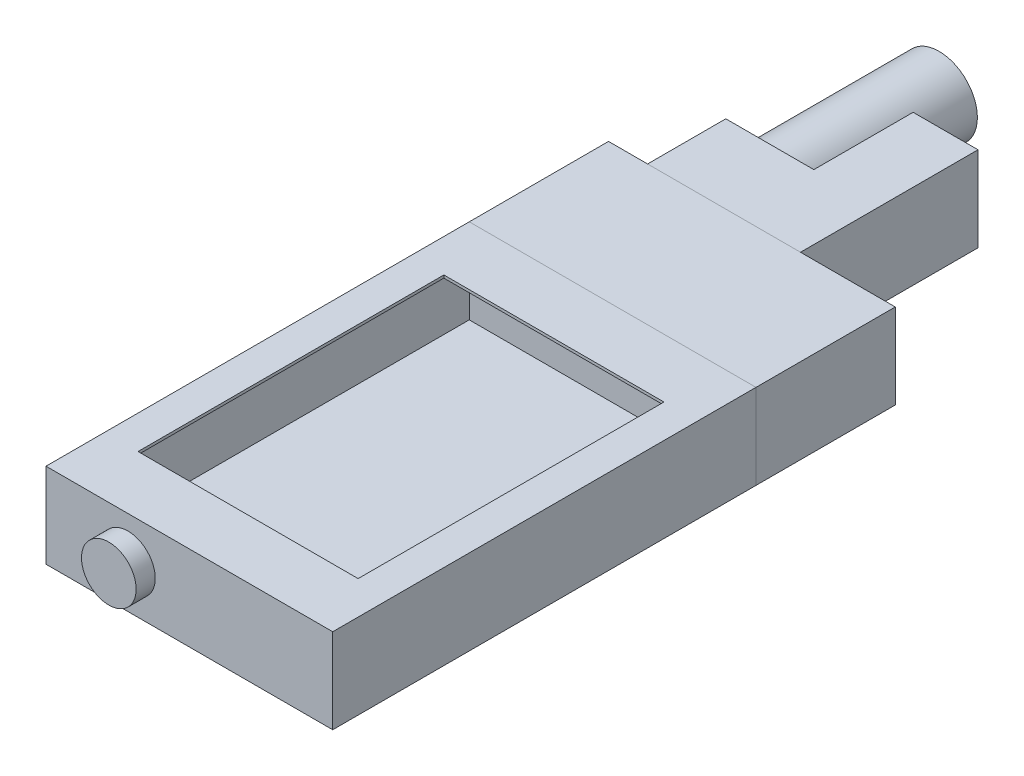
ISO-10303-21;
HEADER;
FILE_DESCRIPTION(('STEP AP214'),'2;1');
FILE_NAME('part.step','',(''),(''),'','','');
FILE_SCHEMA(('AUTOMOTIVE_DESIGN { 1 0 10303 214 1 1 1 1 }'));
ENDSEC;
DATA;
#1=APPLICATION_CONTEXT('core data for automotive mechanical design processes');
#2=APPLICATION_PROTOCOL_DEFINITION('international standard','automotive_design',2000,#1);
#3=PRODUCT_CONTEXT('',#1,'mechanical');
#4=PRODUCT('Part','Part','',(#3));
#5=PRODUCT_RELATED_PRODUCT_CATEGORY('part','',(#4));
#6=PRODUCT_DEFINITION_FORMATION('','',#4);
#7=PRODUCT_DEFINITION_CONTEXT('part definition',#1,'design');
#8=PRODUCT_DEFINITION('design','',#6,#7);
#9=PRODUCT_DEFINITION_SHAPE('','',#8);
#10=(LENGTH_UNIT() NAMED_UNIT(*) SI_UNIT(.MILLI.,.METRE.));
#11=(NAMED_UNIT(*) PLANE_ANGLE_UNIT() SI_UNIT($,.RADIAN.));
#12=(NAMED_UNIT(*) SI_UNIT($,.STERADIAN.) SOLID_ANGLE_UNIT());
#13=UNCERTAINTY_MEASURE_WITH_UNIT(LENGTH_MEASURE(1.E-05),#10,'distance_accuracy_value','');
#14=(GEOMETRIC_REPRESENTATION_CONTEXT(3) GLOBAL_UNCERTAINTY_ASSIGNED_CONTEXT((#13)) GLOBAL_UNIT_ASSIGNED_CONTEXT((#10,
#11,#12)) REPRESENTATION_CONTEXT('',''));
#15=CARTESIAN_POINT('',(0.,0.,0.));
#16=DIRECTION('',(0.,0.,1.));
#17=DIRECTION('',(1.,0.,0.));
#18=AXIS2_PLACEMENT_3D('',#15,#16,#17);
#19=CARTESIAN_POINT('',(0.,15.55,0.));
#20=DIRECTION('',(0.,-1.,0.));
#21=DIRECTION('',(0.,0.,-1.));
#22=AXIS2_PLACEMENT_3D('',#19,#20,#21);
#23=PLANE('',#22);
#24=DIRECTION('',(1.,0.,0.));
#25=VECTOR('',#24,1.);
#26=CARTESIAN_POINT('',(-9.0679364494854,15.55,-128.5));
#27=LINE('',#26,#25);
#28=CARTESIAN_POINT('',(17.8,15.55,-128.5));
#29=VERTEX_POINT('',#28);
#30=CARTESIAN_POINT('',(-38.2,15.55,-128.5));
#31=VERTEX_POINT('',#30);
#32=EDGE_CURVE('P0_E19',#29,#31,#27,.F.);
#33=ORIENTED_EDGE('',*,*,#32,.F.);
#34=DIRECTION('',(0.,0.,-1.));
#35=VECTOR('',#34,1.);
#36=CARTESIAN_POINT('',(17.8,15.55,-128.5));
#37=LINE('',#36,#35);
#38=CARTESIAN_POINT('',(17.8,15.55,-193.5));
#39=VERTEX_POINT('',#38);
#40=EDGE_CURVE('P0_E70',#39,#29,#37,.F.);
#41=ORIENTED_EDGE('',*,*,#40,.F.);
#42=DIRECTION('',(-1.,0.,0.));
#43=VECTOR('',#42,1.);
#44=CARTESIAN_POINT('',(-5.96,15.55,-193.5));
#45=LINE('',#44,#43);
#46=CARTESIAN_POINT('',(-5.95999999999999,15.55,-193.5));
#47=VERTEX_POINT('',#46);
#48=EDGE_CURVE('P0_E65',#47,#39,#45,.F.);
#49=ORIENTED_EDGE('',*,*,#48,.F.);
#50=DIRECTION('',(0.,0.,1.));
#51=VECTOR('',#50,1.);
#52=CARTESIAN_POINT('',(-5.95999999999999,15.55,-157.15));
#53=LINE('',#52,#51);
#54=CARTESIAN_POINT('',(-5.95999999999999,15.55,-157.15));
#55=VERTEX_POINT('',#54);
#56=EDGE_CURVE('P0_E92',#55,#47,#53,.F.);
#57=ORIENTED_EDGE('',*,*,#56,.F.);
#58=DIRECTION('',(-1.,0.,0.));
#59=VECTOR('',#58,1.);
#60=CARTESIAN_POINT('',(-38.2,15.55,-157.15));
#61=LINE('',#60,#59);
#62=CARTESIAN_POINT('',(-38.2,15.55,-157.15));
#63=VERTEX_POINT('',#62);
#64=EDGE_CURVE('P0_E96',#63,#55,#61,.F.);
#65=ORIENTED_EDGE('',*,*,#64,.F.);
#66=DIRECTION('',(0.,0.,1.));
#67=VECTOR('',#66,1.);
#68=CARTESIAN_POINT('',(-38.2,15.55,-128.5));
#69=LINE('',#68,#67);
#70=EDGE_CURVE('P0_E81',#31,#63,#69,.F.);
#71=ORIENTED_EDGE('',*,*,#70,.F.);
#72=EDGE_LOOP('',(#33,#41,#49,#57,#65,#71));
#73=FACE_BOUND('',#72,.T.);
#74=ADVANCED_FACE('P0_F16',(#73),#23,.F.);
#75=CARTESIAN_POINT('',(-9.0679364494854,-101.346270315207,-128.5));
#76=DIRECTION('',(0.,0.,1.));
#77=DIRECTION('',(1.,0.,0.));
#78=AXIS2_PLACEMENT_3D('',#75,#76,#77);
#79=PLANE('',#78);
#80=ORIENTED_EDGE('',*,*,#32,.T.);
#81=DIRECTION('',(0.,1.,0.));
#82=VECTOR('',#81,1.);
#83=CARTESIAN_POINT('',(-38.2,-101.346270315207,-128.5));
#84=LINE('',#83,#82);
#85=CARTESIAN_POINT('',(-38.2,-15.55,-128.5));
#86=VERTEX_POINT('',#85);
#87=EDGE_CURVE('P0_E100',#86,#31,#84,.T.);
#88=ORIENTED_EDGE('',*,*,#87,.F.);
#89=DIRECTION('',(1.,0.,0.));
#90=VECTOR('',#89,1.);
#91=CARTESIAN_POINT('',(52.5,-15.55,-128.5));
#92=LINE('',#91,#90);
#93=CARTESIAN_POINT('',(17.8,-15.55,-128.5));
#94=VERTEX_POINT('',#93);
#95=EDGE_CURVE('P0_E87',#86,#94,#92,.T.);
#96=ORIENTED_EDGE('',*,*,#95,.T.);
#97=DIRECTION('',(0.,1.,0.));
#98=VECTOR('',#97,1.);
#99=CARTESIAN_POINT('',(17.8,-101.346270315207,-128.5));
#100=LINE('',#99,#98);
#101=EDGE_CURVE('P0_E75',#29,#94,#100,.F.);
#102=ORIENTED_EDGE('',*,*,#101,.F.);
#103=EDGE_LOOP('',(#80,#88,#96,#102));
#104=FACE_BOUND('',#103,.T.);
#105=ADVANCED_FACE('P0_F86',(#104),#79,.T.);
#106=CARTESIAN_POINT('',(17.8,-101.346270315207,-128.5));
#107=DIRECTION('',(1.,0.,0.));
#108=DIRECTION('',(0.,0.,-1.));
#109=AXIS2_PLACEMENT_3D('',#106,#107,#108);
#110=PLANE('',#109);
#111=ORIENTED_EDGE('',*,*,#40,.T.);
#112=ORIENTED_EDGE('',*,*,#101,.T.);
#113=DIRECTION('',(0.,0.,1.));
#114=VECTOR('',#113,1.);
#115=CARTESIAN_POINT('',(17.8,-15.55,77.5));
#116=LINE('',#115,#114);
#117=CARTESIAN_POINT('',(17.8,-15.55,-193.5));
#118=VERTEX_POINT('',#117);
#119=EDGE_CURVE('P0_E105',#94,#118,#116,.F.);
#120=ORIENTED_EDGE('',*,*,#119,.T.);
#121=DIRECTION('',(0.,1.,0.));
#122=VECTOR('',#121,1.);
#123=CARTESIAN_POINT('',(17.8,-101.346270315207,-193.5));
#124=LINE('',#123,#122);
#125=EDGE_CURVE('P0_E77',#39,#118,#124,.F.);
#126=ORIENTED_EDGE('',*,*,#125,.F.);
#127=EDGE_LOOP('',(#111,#112,#120,#126));
#128=FACE_BOUND('',#127,.T.);
#129=ADVANCED_FACE('P0_F72',(#128),#110,.T.);
#130=CARTESIAN_POINT('',(-5.96,-101.346270315207,-193.5));
#131=DIRECTION('',(0.,0.,-1.));
#132=DIRECTION('',(-1.,0.,0.));
#133=AXIS2_PLACEMENT_3D('',#130,#131,#132);
#134=PLANE('',#133);
#135=ORIENTED_EDGE('',*,*,#48,.T.);
#136=ORIENTED_EDGE('',*,*,#125,.T.);
#137=DIRECTION('',(1.,0.,0.));
#138=VECTOR('',#137,1.);
#139=CARTESIAN_POINT('',(52.5,-15.55,-193.5));
#140=LINE('',#139,#138);
#141=CARTESIAN_POINT('',(-5.96,-15.55,-193.5));
#142=VERTEX_POINT('',#141);
#143=EDGE_CURVE('P0_E107',#118,#142,#140,.F.);
#144=ORIENTED_EDGE('',*,*,#143,.T.);
#145=DIRECTION('',(0.,1.,0.));
#146=VECTOR('',#145,1.);
#147=CARTESIAN_POINT('',(-5.96,-101.346270315207,-193.5));
#148=LINE('',#147,#146);
#149=EDGE_CURVE('P0_E94',#47,#142,#148,.F.);
#150=ORIENTED_EDGE('',*,*,#149,.F.);
#151=EDGE_LOOP('',(#135,#136,#144,#150));
#152=FACE_BOUND('',#151,.T.);
#153=ADVANCED_FACE('P0_F125',(#152),#134,.T.);
#154=CARTESIAN_POINT('',(-5.95999999999999,-101.346270315207,-157.15));
#155=DIRECTION('',(-1.,0.,0.));
#156=DIRECTION('',(0.,0.,1.));
#157=AXIS2_PLACEMENT_3D('',#154,#155,#156);
#158=PLANE('',#157);
#159=ORIENTED_EDGE('',*,*,#56,.T.);
#160=ORIENTED_EDGE('',*,*,#149,.T.);
#161=DIRECTION('',(0.,0.,1.));
#162=VECTOR('',#161,1.);
#163=CARTESIAN_POINT('',(-5.96,-15.55,77.5));
#164=LINE('',#163,#162);
#165=CARTESIAN_POINT('',(-5.95999999999999,-15.55,-157.15));
#166=VERTEX_POINT('',#165);
#167=EDGE_CURVE('P0_E110',#142,#166,#164,.T.);
#168=ORIENTED_EDGE('',*,*,#167,.T.);
#169=DIRECTION('',(0.,1.,0.));
#170=VECTOR('',#169,1.);
#171=CARTESIAN_POINT('',(-5.95999999999999,-101.346270315207,-157.15));
#172=LINE('',#171,#170);
#173=EDGE_CURVE('P0_E98',#55,#166,#172,.F.);
#174=ORIENTED_EDGE('',*,*,#173,.F.);
#175=EDGE_LOOP('',(#159,#160,#168,#174));
#176=FACE_BOUND('',#175,.T.);
#177=ADVANCED_FACE('P0_F123',(#176),#158,.T.);
#178=CARTESIAN_POINT('',(-38.2,-101.346270315207,-157.15));
#179=DIRECTION('',(0.,0.,-1.));
#180=DIRECTION('',(-1.,0.,0.));
#181=AXIS2_PLACEMENT_3D('',#178,#179,#180);
#182=PLANE('',#181);
#183=ORIENTED_EDGE('',*,*,#64,.T.);
#184=ORIENTED_EDGE('',*,*,#173,.T.);
#185=DIRECTION('',(1.,0.,0.));
#186=VECTOR('',#185,1.);
#187=CARTESIAN_POINT('',(52.5,-15.55,-157.15));
#188=LINE('',#187,#186);
#189=CARTESIAN_POINT('',(-38.2,-15.55,-157.15));
#190=VERTEX_POINT('',#189);
#191=EDGE_CURVE('P0_E25',#166,#190,#188,.F.);
#192=ORIENTED_EDGE('',*,*,#191,.T.);
#193=DIRECTION('',(0.,1.,0.));
#194=VECTOR('',#193,1.);
#195=CARTESIAN_POINT('',(-38.2,-101.346270315207,-157.15));
#196=LINE('',#195,#194);
#197=EDGE_CURVE('P0_E33',#63,#190,#196,.F.);
#198=ORIENTED_EDGE('',*,*,#197,.F.);
#199=EDGE_LOOP('',(#183,#184,#192,#198));
#200=FACE_BOUND('',#199,.T.);
#201=ADVANCED_FACE('P0_F116',(#200),#182,.T.);
#202=CARTESIAN_POINT('',(-38.2,-101.346270315207,-128.5));
#203=DIRECTION('',(-1.,0.,0.));
#204=DIRECTION('',(0.,0.,1.));
#205=AXIS2_PLACEMENT_3D('',#202,#203,#204);
#206=PLANE('',#205);
#207=ORIENTED_EDGE('',*,*,#70,.T.);
#208=ORIENTED_EDGE('',*,*,#197,.T.);
#209=DIRECTION('',(0.,0.,1.));
#210=VECTOR('',#209,1.);
#211=CARTESIAN_POINT('',(-38.2,-15.55,77.5));
#212=LINE('',#211,#210);
#213=EDGE_CURVE('P0_E11',#190,#86,#212,.T.);
#214=ORIENTED_EDGE('',*,*,#213,.T.);
#215=ORIENTED_EDGE('',*,*,#87,.T.);
#216=EDGE_LOOP('',(#207,#208,#214,#215));
#217=FACE_BOUND('',#216,.T.);
#218=ADVANCED_FACE('P0_F126',(#217),#206,.T.);
#219=CARTESIAN_POINT('',(52.5,-15.55,77.5));
#220=DIRECTION('',(0.,1.,0.));
#221=DIRECTION('',(0.,0.,1.));
#222=AXIS2_PLACEMENT_3D('',#219,#220,#221);
#223=PLANE('',#222);
#224=ORIENTED_EDGE('',*,*,#191,.F.);
#225=ORIENTED_EDGE('',*,*,#167,.F.);
#226=ORIENTED_EDGE('',*,*,#143,.F.);
#227=ORIENTED_EDGE('',*,*,#119,.F.);
#228=ORIENTED_EDGE('',*,*,#95,.F.);
#229=ORIENTED_EDGE('',*,*,#213,.F.);
#230=EDGE_LOOP('',(#224,#225,#226,#227,#228,#229));
#231=FACE_BOUND('',#230,.T.);
#232=ADVANCED_FACE('P0_F120',(#231),#223,.F.);
#233=CLOSED_SHELL('',(#74,#105,#129,#153,#177,#201,#218,#232));
#234=MANIFOLD_SOLID_BREP('P0_B1',#233);
#235=CARTESIAN_POINT('',(-22.08,0.,-219.15));
#236=DIRECTION('',(0.,0.,-1.));
#237=DIRECTION('',(-1.,0.,0.));
#238=AXIS2_PLACEMENT_3D('',#235,#236,#237);
#239=PLANE('',#238);
#240=CARTESIAN_POINT('',(-22.08,0.,-219.15));
#241=DIRECTION('',(0.,0.,1.));
#242=DIRECTION('',(1.,0.,0.));
#243=AXIS2_PLACEMENT_3D('',#240,#241,#242);
#244=CIRCLE('',#243,14.);
#245=CARTESIAN_POINT('',(-8.07999999999999,0.,-219.15));
#246=VERTEX_POINT('',#245);
#247=EDGE_CURVE('P1_E17',#246,#246,#244,.T.);
#248=ORIENTED_EDGE('',*,*,#247,.F.);
#249=EDGE_LOOP('',(#248));
#250=FACE_BOUND('',#249,.T.);
#251=ADVANCED_FACE('P1_F14',(#250),#239,.T.);
#252=CARTESIAN_POINT('',(-22.08,0.,-157.15));
#253=DIRECTION('',(0.,0.,-1.));
#254=DIRECTION('',(-1.,0.,0.));
#255=AXIS2_PLACEMENT_3D('',#252,#253,#254);
#256=PLANE('',#255);
#257=CARTESIAN_POINT('',(-22.08,0.,-157.15));
#258=DIRECTION('',(0.,0.,1.));
#259=DIRECTION('',(1.,0.,0.));
#260=AXIS2_PLACEMENT_3D('',#257,#258,#259);
#261=CIRCLE('',#260,14.);
#262=CARTESIAN_POINT('',(-8.07999999999999,0.,-157.15));
#263=VERTEX_POINT('',#262);
#264=EDGE_CURVE('P1_E10',#263,#263,#261,.F.);
#265=ORIENTED_EDGE('',*,*,#264,.F.);
#266=EDGE_LOOP('',(#265));
#267=FACE_BOUND('',#266,.T.);
#268=ADVANCED_FACE('P1_F29',(#267),#256,.F.);
#269=CARTESIAN_POINT('',(-22.08,0.,-219.15));
#270=DIRECTION('',(0.,0.,1.));
#271=DIRECTION('',(1.,0.,0.));
#272=AXIS2_PLACEMENT_3D('',#269,#270,#271);
#273=CYLINDRICAL_SURFACE('',#272,14.);
#274=ORIENTED_EDGE('',*,*,#264,.T.);
#275=EDGE_LOOP('',(#274));
#276=FACE_BOUND('',#275,.T.);
#277=ORIENTED_EDGE('',*,*,#247,.T.);
#278=EDGE_LOOP('',(#277));
#279=FACE_BOUND('',#278,.T.);
#280=ADVANCED_FACE('P1_F26',(#276,#279),#273,.T.);
#281=CLOSED_SHELL('',(#251,#268,#280));
#282=MANIFOLD_SOLID_BREP('P1_B1',#281);
#283=CARTESIAN_POINT('',(52.5,-15.55,77.5));
#284=DIRECTION('',(0.,1.,0.));
#285=DIRECTION('',(0.,0.,1.));
#286=AXIS2_PLACEMENT_3D('',#283,#284,#285);
#287=PLANE('',#286);
#288=DIRECTION('',(-1.,0.,0.));
#289=VECTOR('',#288,1.);
#290=CARTESIAN_POINT('',(-52.5,-15.55,-128.5));
#291=LINE('',#290,#289);
#292=CARTESIAN_POINT('',(52.5,-15.55,-128.5));
#293=VERTEX_POINT('',#292);
#294=CARTESIAN_POINT('',(-52.5,-15.55,-128.5));
#295=VERTEX_POINT('',#294);
#296=EDGE_CURVE('P2_E19',#293,#295,#291,.T.);
#297=ORIENTED_EDGE('',*,*,#296,.F.);
#298=DIRECTION('',(0.,0.,-1.));
#299=VECTOR('',#298,1.);
#300=CARTESIAN_POINT('',(52.5,-15.55,-77.5));
#301=LINE('',#300,#299);
#302=CARTESIAN_POINT('',(52.5,-15.55,-77.5));
#303=VERTEX_POINT('',#302);
#304=EDGE_CURVE('P2_E57',#303,#293,#301,.T.);
#305=ORIENTED_EDGE('',*,*,#304,.F.);
#306=DIRECTION('',(1.,0.,0.));
#307=VECTOR('',#306,1.);
#308=CARTESIAN_POINT('',(-52.5,-15.55,-77.5));
#309=LINE('',#308,#307);
#310=CARTESIAN_POINT('',(-52.5,-15.55,-77.5));
#311=VERTEX_POINT('',#310);
#312=EDGE_CURVE('P2_E52',#311,#303,#309,.T.);
#313=ORIENTED_EDGE('',*,*,#312,.F.);
#314=DIRECTION('',(0.,0.,1.));
#315=VECTOR('',#314,1.);
#316=CARTESIAN_POINT('',(-52.5,-15.55,-77.5));
#317=LINE('',#316,#315);
#318=EDGE_CURVE('P2_E67',#295,#311,#317,.T.);
#319=ORIENTED_EDGE('',*,*,#318,.F.);
#320=EDGE_LOOP('',(#297,#305,#313,#319));
#321=FACE_BOUND('',#320,.T.);
#322=ADVANCED_FACE('P2_F16',(#321),#287,.F.);
#323=CARTESIAN_POINT('',(-52.5,-132.280458750062,-128.5));
#324=DIRECTION('',(0.,0.,-1.));
#325=DIRECTION('',(-1.,0.,0.));
#326=AXIS2_PLACEMENT_3D('',#323,#324,#325);
#327=PLANE('',#326);
#328=DIRECTION('',(1.,0.,0.));
#329=VECTOR('',#328,1.);
#330=CARTESIAN_POINT('',(0.,15.55,-128.5));
#331=LINE('',#330,#329);
#332=CARTESIAN_POINT('',(-52.5,15.55,-128.5));
#333=VERTEX_POINT('',#332);
#334=CARTESIAN_POINT('',(52.5,15.55,-128.5));
#335=VERTEX_POINT('',#334);
#336=EDGE_CURVE('P2_E73',#333,#335,#331,.T.);
#337=ORIENTED_EDGE('',*,*,#336,.T.);
#338=DIRECTION('',(0.,1.,0.));
#339=VECTOR('',#338,1.);
#340=CARTESIAN_POINT('',(52.5,-132.280458750062,-128.5));
#341=LINE('',#340,#339);
#342=EDGE_CURVE('P2_E62',#293,#335,#341,.T.);
#343=ORIENTED_EDGE('',*,*,#342,.F.);
#344=ORIENTED_EDGE('',*,*,#296,.T.);
#345=DIRECTION('',(0.,1.,0.));
#346=VECTOR('',#345,1.);
#347=CARTESIAN_POINT('',(-52.5,-132.280458750062,-128.5));
#348=LINE('',#347,#346);
#349=EDGE_CURVE('P2_E80',#333,#295,#348,.F.);
#350=ORIENTED_EDGE('',*,*,#349,.F.);
#351=EDGE_LOOP('',(#337,#343,#344,#350));
#352=FACE_BOUND('',#351,.T.);
#353=ADVANCED_FACE('P2_F72',(#352),#327,.T.);
#354=CARTESIAN_POINT('',(52.5,-132.280458750062,-77.5));
#355=DIRECTION('',(1.,0.,0.));
#356=DIRECTION('',(0.,0.,-1.));
#357=AXIS2_PLACEMENT_3D('',#354,#355,#356);
#358=PLANE('',#357);
#359=DIRECTION('',(0.,0.,-1.));
#360=VECTOR('',#359,1.);
#361=CARTESIAN_POINT('',(52.5,15.55,0.));
#362=LINE('',#361,#360);
#363=CARTESIAN_POINT('',(52.5,15.55,-77.5));
#364=VERTEX_POINT('',#363);
#365=EDGE_CURVE('P2_E83',#335,#364,#362,.F.);
#366=ORIENTED_EDGE('',*,*,#365,.T.);
#367=DIRECTION('',(0.,1.,0.));
#368=VECTOR('',#367,1.);
#369=CARTESIAN_POINT('',(52.5,-132.280458750062,-77.5));
#370=LINE('',#369,#368);
#371=EDGE_CURVE('P2_E64',#303,#364,#370,.T.);
#372=ORIENTED_EDGE('',*,*,#371,.F.);
#373=ORIENTED_EDGE('',*,*,#304,.T.);
#374=ORIENTED_EDGE('',*,*,#342,.T.);
#375=EDGE_LOOP('',(#366,#372,#373,#374));
#376=FACE_BOUND('',#375,.T.);
#377=ADVANCED_FACE('P2_F60',(#376),#358,.T.);
#378=CARTESIAN_POINT('',(-52.5,-132.280458750062,-77.5));
#379=DIRECTION('',(0.,0.,1.));
#380=DIRECTION('',(1.,0.,0.));
#381=AXIS2_PLACEMENT_3D('',#378,#379,#380);
#382=PLANE('',#381);
#383=DIRECTION('',(1.,0.,0.));
#384=VECTOR('',#383,1.);
#385=CARTESIAN_POINT('',(0.,15.55,-77.5));
#386=LINE('',#385,#384);
#387=CARTESIAN_POINT('',(-52.5,15.55,-77.5));
#388=VERTEX_POINT('',#387);
#389=EDGE_CURVE('P2_E25',#364,#388,#386,.F.);
#390=ORIENTED_EDGE('',*,*,#389,.T.);
#391=DIRECTION('',(0.,1.,0.));
#392=VECTOR('',#391,1.);
#393=CARTESIAN_POINT('',(-52.5,-132.280458750062,-77.5));
#394=LINE('',#393,#392);
#395=EDGE_CURVE('P2_E33',#311,#388,#394,.T.);
#396=ORIENTED_EDGE('',*,*,#395,.F.);
#397=ORIENTED_EDGE('',*,*,#312,.T.);
#398=ORIENTED_EDGE('',*,*,#371,.T.);
#399=EDGE_LOOP('',(#390,#396,#397,#398));
#400=FACE_BOUND('',#399,.T.);
#401=ADVANCED_FACE('P2_F87',(#400),#382,.T.);
#402=CARTESIAN_POINT('',(-52.5,-132.280458750062,-77.5));
#403=DIRECTION('',(-1.,0.,0.));
#404=DIRECTION('',(0.,0.,1.));
#405=AXIS2_PLACEMENT_3D('',#402,#403,#404);
#406=PLANE('',#405);
#407=DIRECTION('',(0.,0.,-1.));
#408=VECTOR('',#407,1.);
#409=CARTESIAN_POINT('',(-52.5,15.55,0.));
#410=LINE('',#409,#408);
#411=EDGE_CURVE('P2_E11',#388,#333,#410,.T.);
#412=ORIENTED_EDGE('',*,*,#411,.T.);
#413=ORIENTED_EDGE('',*,*,#349,.T.);
#414=ORIENTED_EDGE('',*,*,#318,.T.);
#415=ORIENTED_EDGE('',*,*,#395,.T.);
#416=EDGE_LOOP('',(#412,#413,#414,#415));
#417=FACE_BOUND('',#416,.T.);
#418=ADVANCED_FACE('P2_F90',(#417),#406,.T.);
#419=CARTESIAN_POINT('',(0.,15.55,0.));
#420=DIRECTION('',(0.,-1.,0.));
#421=DIRECTION('',(0.,0.,-1.));
#422=AXIS2_PLACEMENT_3D('',#419,#420,#421);
#423=PLANE('',#422);
#424=ORIENTED_EDGE('',*,*,#389,.F.);
#425=ORIENTED_EDGE('',*,*,#365,.F.);
#426=ORIENTED_EDGE('',*,*,#336,.F.);
#427=ORIENTED_EDGE('',*,*,#411,.F.);
#428=EDGE_LOOP('',(#424,#425,#426,#427));
#429=FACE_BOUND('',#428,.T.);
#430=ADVANCED_FACE('P2_F89',(#429),#423,.F.);
#431=CLOSED_SHELL('',(#322,#353,#377,#401,#418,#430));
#432=MANIFOLD_SOLID_BREP('P2_B1',#431);
#433=CARTESIAN_POINT('',(0.,0.,83.5));
#434=DIRECTION('',(0.,0.,1.));
#435=DIRECTION('',(1.,0.,0.));
#436=AXIS2_PLACEMENT_3D('',#433,#434,#435);
#437=PLANE('',#436);
#438=CARTESIAN_POINT('',(-22.5,0.,83.5));
#439=DIRECTION('',(0.,0.,-1.));
#440=DIRECTION('',(-1.,0.,0.));
#441=AXIS2_PLACEMENT_3D('',#438,#439,#440);
#442=CIRCLE('',#441,9.);
#443=CARTESIAN_POINT('',(-31.5,0.,83.5));
#444=VERTEX_POINT('',#443);
#445=EDGE_CURVE('P3_E19',#444,#444,#442,.T.);
#446=ORIENTED_EDGE('',*,*,#445,.T.);
#447=EDGE_LOOP('',(#446));
#448=FACE_BOUND('',#447,.T.);
#449=ADVANCED_FACE('P3_F16',(#448),#437,.F.);
#450=CARTESIAN_POINT('',(-22.5,0.,84.5));
#451=DIRECTION('',(0.,0.,-1.));
#452=DIRECTION('',(-1.,0.,0.));
#453=AXIS2_PLACEMENT_3D('',#450,#451,#452);
#454=CYLINDRICAL_SURFACE('',#453,9.);
#455=CARTESIAN_POINT('',(-22.5,0.,76.5));
#456=DIRECTION('',(0.,0.,-1.));
#457=DIRECTION('',(-1.,0.,0.));
#458=AXIS2_PLACEMENT_3D('',#455,#456,#457);
#459=CIRCLE('',#458,9.);
#460=CARTESIAN_POINT('',(-31.5,0.,76.5));
#461=VERTEX_POINT('',#460);
#462=EDGE_CURVE('P3_E121',#461,#461,#459,.T.);
#463=ORIENTED_EDGE('',*,*,#462,.T.);
#464=EDGE_LOOP('',(#463));
#465=FACE_BOUND('',#464,.T.);
#466=ORIENTED_EDGE('',*,*,#445,.F.);
#467=EDGE_LOOP('',(#466));
#468=FACE_BOUND('',#467,.T.);
#469=ADVANCED_FACE('P3_F159',(#465,#468),#454,.F.);
#470=CARTESIAN_POINT('',(52.5,-14.55,77.5));
#471=DIRECTION('',(0.,1.,0.));
#472=DIRECTION('',(0.,0.,1.));
#473=AXIS2_PLACEMENT_3D('',#470,#471,#472);
#474=PLANE('',#473);
#475=DIRECTION('',(0.,0.,1.));
#476=VECTOR('',#475,1.);
#477=CARTESIAN_POINT('',(51.5,-14.55,0.));
#478=LINE('',#477,#476);
#479=CARTESIAN_POINT('',(51.5,-14.55,-76.5));
#480=VERTEX_POINT('',#479);
#481=CARTESIAN_POINT('',(51.5,-14.55,76.5));
#482=VERTEX_POINT('',#481);
#483=EDGE_CURVE('P3_E112',#480,#482,#478,.T.);
#484=ORIENTED_EDGE('',*,*,#483,.F.);
#485=DIRECTION('',(1.,0.,0.));
#486=VECTOR('',#485,1.);
#487=CARTESIAN_POINT('',(52.5,-14.55,-76.5));
#488=LINE('',#487,#486);
#489=CARTESIAN_POINT('',(-51.5,-14.55,-76.5));
#490=VERTEX_POINT('',#489);
#491=EDGE_CURVE('P3_E104',#490,#480,#488,.T.);
#492=ORIENTED_EDGE('',*,*,#491,.F.);
#493=DIRECTION('',(0.,0.,1.));
#494=VECTOR('',#493,1.);
#495=CARTESIAN_POINT('',(-51.5,-14.55,0.));
#496=LINE('',#495,#494);
#497=CARTESIAN_POINT('',(-51.5,-14.55,76.5));
#498=VERTEX_POINT('',#497);
#499=EDGE_CURVE('P3_E115',#490,#498,#496,.T.);
#500=ORIENTED_EDGE('',*,*,#499,.T.);
#501=DIRECTION('',(1.,0.,0.));
#502=VECTOR('',#501,1.);
#503=CARTESIAN_POINT('',(52.5,-14.55,76.5));
#504=LINE('',#503,#502);
#505=EDGE_CURVE('P3_E109',#498,#482,#504,.T.);
#506=ORIENTED_EDGE('',*,*,#505,.T.);
#507=EDGE_LOOP('',(#484,#492,#500,#506));
#508=FACE_BOUND('',#507,.T.);
#509=ADVANCED_FACE('P3_F111',(#508),#474,.T.);
#510=CARTESIAN_POINT('',(52.5,-15.55,76.5));
#511=DIRECTION('',(0.,0.,1.));
#512=DIRECTION('',(1.,0.,0.));
#513=AXIS2_PLACEMENT_3D('',#510,#511,#512);
#514=PLANE('',#513);
#515=DIRECTION('',(1.,0.,0.));
#516=VECTOR('',#515,1.);
#517=CARTESIAN_POINT('',(52.5,14.55,76.5));
#518=LINE('',#517,#516);
#519=CARTESIAN_POINT('',(-51.5,14.55,76.5));
#520=VERTEX_POINT('',#519);
#521=CARTESIAN_POINT('',(51.5,14.55,76.5));
#522=VERTEX_POINT('',#521);
#523=EDGE_CURVE('P3_E132',#520,#522,#518,.T.);
#524=ORIENTED_EDGE('',*,*,#523,.T.);
#525=DIRECTION('',(0.,1.,0.));
#526=VECTOR('',#525,1.);
#527=CARTESIAN_POINT('',(51.5,0.,76.5));
#528=LINE('',#527,#526);
#529=EDGE_CURVE('P3_E120',#482,#522,#528,.T.);
#530=ORIENTED_EDGE('',*,*,#529,.F.);
#531=ORIENTED_EDGE('',*,*,#505,.F.);
#532=DIRECTION('',(0.,1.,0.));
#533=VECTOR('',#532,1.);
#534=CARTESIAN_POINT('',(-51.5,0.,76.5));
#535=LINE('',#534,#533);
#536=EDGE_CURVE('P3_E422',#498,#520,#535,.T.);
#537=ORIENTED_EDGE('',*,*,#536,.T.);
#538=EDGE_LOOP('',(#524,#530,#531,#537));
#539=FACE_BOUND('',#538,.T.);
#540=ORIENTED_EDGE('',*,*,#462,.F.);
#541=EDGE_LOOP('',(#540));
#542=FACE_BOUND('',#541,.T.);
#543=ADVANCED_FACE('P3_F130',(#539,#542),#514,.F.);
#544=CARTESIAN_POINT('',(51.5,0.,0.));
#545=DIRECTION('',(-1.,0.,0.));
#546=DIRECTION('',(0.,0.,1.));
#547=AXIS2_PLACEMENT_3D('',#544,#545,#546);
#548=PLANE('',#547);
#549=DIRECTION('',(0.,1.,0.));
#550=VECTOR('',#549,1.);
#551=CARTESIAN_POINT('',(51.5,-15.55,-76.5));
#552=LINE('',#551,#550);
#553=CARTESIAN_POINT('',(51.5,14.55,-76.5));
#554=VERTEX_POINT('',#553);
#555=EDGE_CURVE('P3_E127',#480,#554,#552,.T.);
#556=ORIENTED_EDGE('',*,*,#555,.F.);
#557=ORIENTED_EDGE('',*,*,#483,.T.);
#558=ORIENTED_EDGE('',*,*,#529,.T.);
#559=DIRECTION('',(0.,0.,1.));
#560=VECTOR('',#559,1.);
#561=CARTESIAN_POINT('',(51.5,14.55,77.5));
#562=LINE('',#561,#560);
#563=EDGE_CURVE('P3_E414',#522,#554,#562,.F.);
#564=ORIENTED_EDGE('',*,*,#563,.T.);
#565=EDGE_LOOP('',(#556,#557,#558,#564));
#566=FACE_BOUND('',#565,.T.);
#567=ADVANCED_FACE('P3_F124',(#566),#548,.T.);
#568=CARTESIAN_POINT('',(52.5,-15.55,-76.5));
#569=DIRECTION('',(0.,0.,1.));
#570=DIRECTION('',(1.,0.,0.));
#571=AXIS2_PLACEMENT_3D('',#568,#569,#570);
#572=PLANE('',#571);
#573=ORIENTED_EDGE('',*,*,#555,.T.);
#574=DIRECTION('',(1.,0.,0.));
#575=VECTOR('',#574,1.);
#576=CARTESIAN_POINT('',(52.5,14.55,-76.5));
#577=LINE('',#576,#575);
#578=CARTESIAN_POINT('',(-51.5,14.55,-76.5));
#579=VERTEX_POINT('',#578);
#580=EDGE_CURVE('P3_E409',#554,#579,#577,.F.);
#581=ORIENTED_EDGE('',*,*,#580,.T.);
#582=DIRECTION('',(0.,1.,0.));
#583=VECTOR('',#582,1.);
#584=CARTESIAN_POINT('',(-51.5,0.,-76.5));
#585=LINE('',#584,#583);
#586=EDGE_CURVE('P3_E410',#579,#490,#585,.F.);
#587=ORIENTED_EDGE('',*,*,#586,.T.);
#588=ORIENTED_EDGE('',*,*,#491,.T.);
#589=EDGE_LOOP('',(#573,#581,#587,#588));
#590=FACE_BOUND('',#589,.T.);
#591=ADVANCED_FACE('P3_F226',(#590),#572,.T.);
#592=CARTESIAN_POINT('',(-51.5,0.,0.));
#593=DIRECTION('',(-1.,0.,0.));
#594=DIRECTION('',(0.,0.,1.));
#595=AXIS2_PLACEMENT_3D('',#592,#593,#594);
#596=PLANE('',#595);
#597=ORIENTED_EDGE('',*,*,#499,.F.);
#598=ORIENTED_EDGE('',*,*,#586,.F.);
#599=DIRECTION('',(0.,0.,1.));
#600=VECTOR('',#599,1.);
#601=CARTESIAN_POINT('',(-51.5,14.55,77.5));
#602=LINE('',#601,#600);
#603=EDGE_CURVE('P3_E416',#579,#520,#602,.T.);
#604=ORIENTED_EDGE('',*,*,#603,.T.);
#605=ORIENTED_EDGE('',*,*,#536,.F.);
#606=EDGE_LOOP('',(#597,#598,#604,#605));
#607=FACE_BOUND('',#606,.T.);
#608=ADVANCED_FACE('P3_F222',(#607),#596,.F.);
#609=CARTESIAN_POINT('',(52.5,14.55,77.5));
#610=DIRECTION('',(0.,1.,0.));
#611=DIRECTION('',(0.,0.,1.));
#612=AXIS2_PLACEMENT_3D('',#609,#610,#611);
#613=PLANE('',#612);
#614=ORIENTED_EDGE('',*,*,#580,.F.);
#615=ORIENTED_EDGE('',*,*,#563,.F.);
#616=ORIENTED_EDGE('',*,*,#523,.F.);
#617=ORIENTED_EDGE('',*,*,#603,.F.);
#618=EDGE_LOOP('',(#614,#615,#616,#617));
#619=FACE_BOUND('',#618,.T.);
#620=DIRECTION('',(0.,0.,-1.));
#621=VECTOR('',#620,1.);
#622=CARTESIAN_POINT('',(40.3,14.55,56.));
#623=LINE('',#622,#621);
#624=CARTESIAN_POINT('',(40.3,14.55,56.));
#625=VERTEX_POINT('',#624);
#626=CARTESIAN_POINT('',(40.3,14.55,-56.));
#627=VERTEX_POINT('',#626);
#628=EDGE_CURVE('P3_E430',#625,#627,#623,.T.);
#629=ORIENTED_EDGE('',*,*,#628,.T.);
#630=DIRECTION('',(-1.,0.,0.));
#631=VECTOR('',#630,1.);
#632=CARTESIAN_POINT('',(40.3,14.55,-56.));
#633=LINE('',#632,#631);
#634=CARTESIAN_POINT('',(-40.3,14.55,-56.));
#635=VERTEX_POINT('',#634);
#636=EDGE_CURVE('P3_E447',#627,#635,#633,.T.);
#637=ORIENTED_EDGE('',*,*,#636,.T.);
#638=DIRECTION('',(0.,0.,-1.));
#639=VECTOR('',#638,1.);
#640=CARTESIAN_POINT('',(-40.3,14.55,56.));
#641=LINE('',#640,#639);
#642=CARTESIAN_POINT('',(-40.3,14.55,56.));
#643=VERTEX_POINT('',#642);
#644=EDGE_CURVE('P3_E441',#643,#635,#641,.T.);
#645=ORIENTED_EDGE('',*,*,#644,.F.);
#646=DIRECTION('',(-1.,0.,0.));
#647=VECTOR('',#646,1.);
#648=CARTESIAN_POINT('',(40.3,14.55,56.));
#649=LINE('',#648,#647);
#650=EDGE_CURVE('P3_E433',#625,#643,#649,.T.);
#651=ORIENTED_EDGE('',*,*,#650,.F.);
#652=EDGE_LOOP('',(#629,#637,#645,#651));
#653=FACE_BOUND('',#652,.T.);
#654=ADVANCED_FACE('P3_F218',(#619,#653),#613,.F.);
#655=CARTESIAN_POINT('',(0.,0.,84.5));
#656=DIRECTION('',(0.,0.,1.));
#657=DIRECTION('',(1.,0.,0.));
#658=AXIS2_PLACEMENT_3D('',#655,#656,#657);
#659=PLANE('',#658);
#660=CARTESIAN_POINT('',(-22.5,0.,84.5));
#661=DIRECTION('',(0.,0.,-1.));
#662=DIRECTION('',(-1.,0.,0.));
#663=AXIS2_PLACEMENT_3D('',#660,#661,#662);
#664=CIRCLE('',#663,10.);
#665=CARTESIAN_POINT('',(-32.5,0.,84.5));
#666=VERTEX_POINT('',#665);
#667=EDGE_CURVE('P3_E142',#666,#666,#664,.T.);
#668=ORIENTED_EDGE('',*,*,#667,.F.);
#669=EDGE_LOOP('',(#668));
#670=FACE_BOUND('',#669,.T.);
#671=ADVANCED_FACE('P3_F214',(#670),#659,.T.);
#672=CARTESIAN_POINT('',(40.3,5.55,56.));
#673=DIRECTION('',(1.,0.,0.));
#674=DIRECTION('',(0.,0.,-1.));
#675=AXIS2_PLACEMENT_3D('',#672,#673,#674);
#676=PLANE('',#675);
#677=DIRECTION('',(0.,0.,1.));
#678=VECTOR('',#677,1.);
#679=CARTESIAN_POINT('',(40.3,15.55,77.5));
#680=LINE('',#679,#678);
#681=CARTESIAN_POINT('',(40.3,15.55,-56.));
#682=VERTEX_POINT('',#681);
#683=CARTESIAN_POINT('',(40.3,15.55,56.));
#684=VERTEX_POINT('',#683);
#685=EDGE_CURVE('P3_E145',#682,#684,#680,.T.);
#686=ORIENTED_EDGE('',*,*,#685,.F.);
#687=DIRECTION('',(0.,1.,0.));
#688=VECTOR('',#687,1.);
#689=CARTESIAN_POINT('',(40.3,5.55,-56.));
#690=LINE('',#689,#688);
#691=EDGE_CURVE('P3_E146',#682,#627,#690,.F.);
#692=ORIENTED_EDGE('',*,*,#691,.T.);
#693=ORIENTED_EDGE('',*,*,#628,.F.);
#694=DIRECTION('',(0.,1.,0.));
#695=VECTOR('',#694,1.);
#696=CARTESIAN_POINT('',(40.3,5.55,56.));
#697=LINE('',#696,#695);
#698=EDGE_CURVE('P3_E438',#684,#625,#697,.F.);
#699=ORIENTED_EDGE('',*,*,#698,.F.);
#700=EDGE_LOOP('',(#686,#692,#693,#699));
#701=FACE_BOUND('',#700,.T.);
#702=ADVANCED_FACE('P3_F210',(#701),#676,.F.);
#703=CARTESIAN_POINT('',(40.3,5.55,56.));
#704=DIRECTION('',(0.,0.,-1.));
#705=DIRECTION('',(-1.,0.,0.));
#706=AXIS2_PLACEMENT_3D('',#703,#704,#705);
#707=PLANE('',#706);
#708=DIRECTION('',(1.,0.,0.));
#709=VECTOR('',#708,1.);
#710=CARTESIAN_POINT('',(52.5,15.55,56.));
#711=LINE('',#710,#709);
#712=CARTESIAN_POINT('',(-40.3,15.55,56.));
#713=VERTEX_POINT('',#712);
#714=EDGE_CURVE('P3_E457',#684,#713,#711,.F.);
#715=ORIENTED_EDGE('',*,*,#714,.F.);
#716=ORIENTED_EDGE('',*,*,#698,.T.);
#717=ORIENTED_EDGE('',*,*,#650,.T.);
#718=DIRECTION('',(0.,1.,0.));
#719=VECTOR('',#718,1.);
#720=CARTESIAN_POINT('',(-40.3,5.55,56.));
#721=LINE('',#720,#719);
#722=EDGE_CURVE('P3_E443',#713,#643,#721,.F.);
#723=ORIENTED_EDGE('',*,*,#722,.F.);
#724=EDGE_LOOP('',(#715,#716,#717,#723));
#725=FACE_BOUND('',#724,.T.);
#726=ADVANCED_FACE('P3_F206',(#725),#707,.T.);
#727=CARTESIAN_POINT('',(-40.3,5.55,56.));
#728=DIRECTION('',(1.,0.,0.));
#729=DIRECTION('',(0.,0.,-1.));
#730=AXIS2_PLACEMENT_3D('',#727,#728,#729);
#731=PLANE('',#730);
#732=DIRECTION('',(0.,0.,1.));
#733=VECTOR('',#732,1.);
#734=CARTESIAN_POINT('',(-40.3,15.55,77.5));
#735=LINE('',#734,#733);
#736=CARTESIAN_POINT('',(-40.3,15.55,-56.));
#737=VERTEX_POINT('',#736);
#738=EDGE_CURVE('P3_E460',#713,#737,#735,.F.);
#739=ORIENTED_EDGE('',*,*,#738,.F.);
#740=ORIENTED_EDGE('',*,*,#722,.T.);
#741=ORIENTED_EDGE('',*,*,#644,.T.);
#742=DIRECTION('',(0.,1.,0.));
#743=VECTOR('',#742,1.);
#744=CARTESIAN_POINT('',(-40.3,5.55,-56.));
#745=LINE('',#744,#743);
#746=EDGE_CURVE('P3_E450',#635,#737,#745,.T.);
#747=ORIENTED_EDGE('',*,*,#746,.T.);
#748=EDGE_LOOP('',(#739,#740,#741,#747));
#749=FACE_BOUND('',#748,.T.);
#750=ADVANCED_FACE('P3_F202',(#749),#731,.T.);
#751=CARTESIAN_POINT('',(40.3,5.55,-56.));
#752=DIRECTION('',(0.,0.,-1.));
#753=DIRECTION('',(-1.,0.,0.));
#754=AXIS2_PLACEMENT_3D('',#751,#752,#753);
#755=PLANE('',#754);
#756=DIRECTION('',(1.,0.,0.));
#757=VECTOR('',#756,1.);
#758=CARTESIAN_POINT('',(52.5,15.55,-56.));
#759=LINE('',#758,#757);
#760=EDGE_CURVE('P3_E141',#737,#682,#759,.T.);
#761=ORIENTED_EDGE('',*,*,#760,.F.);
#762=ORIENTED_EDGE('',*,*,#746,.F.);
#763=ORIENTED_EDGE('',*,*,#636,.F.);
#764=ORIENTED_EDGE('',*,*,#691,.F.);
#765=EDGE_LOOP('',(#761,#762,#763,#764));
#766=FACE_BOUND('',#765,.T.);
#767=ADVANCED_FACE('P3_F198',(#766),#755,.F.);
#768=CARTESIAN_POINT('',(-22.5,0.,84.5));
#769=DIRECTION('',(0.,0.,-1.));
#770=DIRECTION('',(-1.,0.,0.));
#771=AXIS2_PLACEMENT_3D('',#768,#769,#770);
#772=CYLINDRICAL_SURFACE('',#771,10.);
#773=CARTESIAN_POINT('',(-22.5,0.,77.5));
#774=DIRECTION('',(0.,0.,-1.));
#775=DIRECTION('',(-1.,0.,0.));
#776=AXIS2_PLACEMENT_3D('',#773,#774,#775);
#777=CIRCLE('',#776,10.);
#778=CARTESIAN_POINT('',(-32.5,0.,77.5));
#779=VERTEX_POINT('',#778);
#780=EDGE_CURVE('P3_E136',#779,#779,#777,.T.);
#781=ORIENTED_EDGE('',*,*,#780,.F.);
#782=EDGE_LOOP('',(#781));
#783=FACE_BOUND('',#782,.T.);
#784=ORIENTED_EDGE('',*,*,#667,.T.);
#785=EDGE_LOOP('',(#784));
#786=FACE_BOUND('',#785,.T.);
#787=ADVANCED_FACE('P3_F194',(#783,#786),#772,.T.);
#788=CARTESIAN_POINT('',(52.5,15.55,77.5));
#789=DIRECTION('',(0.,1.,0.));
#790=DIRECTION('',(0.,0.,1.));
#791=AXIS2_PLACEMENT_3D('',#788,#789,#790);
#792=PLANE('',#791);
#793=DIRECTION('',(0.,0.,1.));
#794=VECTOR('',#793,1.);
#795=CARTESIAN_POINT('',(52.5,15.55,0.));
#796=LINE('',#795,#794);
#797=CARTESIAN_POINT('',(52.5,15.55,77.5));
#798=VERTEX_POINT('',#797);
#799=CARTESIAN_POINT('',(52.5,15.55,-77.5));
#800=VERTEX_POINT('',#799);
#801=EDGE_CURVE('P3_E466',#798,#800,#796,.F.);
#802=ORIENTED_EDGE('',*,*,#801,.T.);
#803=DIRECTION('',(1.,0.,0.));
#804=VECTOR('',#803,1.);
#805=CARTESIAN_POINT('',(52.5,15.55,-77.5));
#806=LINE('',#805,#804);
#807=CARTESIAN_POINT('',(-52.5,15.55,-77.5));
#808=VERTEX_POINT('',#807);
#809=EDGE_CURVE('P3_E474',#800,#808,#806,.F.);
#810=ORIENTED_EDGE('',*,*,#809,.T.);
#811=DIRECTION('',(0.,0.,1.));
#812=VECTOR('',#811,1.);
#813=CARTESIAN_POINT('',(-52.5,15.55,0.));
#814=LINE('',#813,#812);
#815=CARTESIAN_POINT('',(-52.5,15.55,77.5));
#816=VERTEX_POINT('',#815);
#817=EDGE_CURVE('P3_E481',#816,#808,#814,.F.);
#818=ORIENTED_EDGE('',*,*,#817,.F.);
#819=DIRECTION('',(1.,0.,0.));
#820=VECTOR('',#819,1.);
#821=CARTESIAN_POINT('',(52.5,15.55,77.5));
#822=LINE('',#821,#820);
#823=EDGE_CURVE('P3_E140',#798,#816,#822,.F.);
#824=ORIENTED_EDGE('',*,*,#823,.F.);
#825=EDGE_LOOP('',(#802,#810,#818,#824));
#826=FACE_BOUND('',#825,.T.);
#827=ORIENTED_EDGE('',*,*,#738,.T.);
#828=ORIENTED_EDGE('',*,*,#760,.T.);
#829=ORIENTED_EDGE('',*,*,#685,.T.);
#830=ORIENTED_EDGE('',*,*,#714,.T.);
#831=EDGE_LOOP('',(#827,#828,#829,#830));
#832=FACE_BOUND('',#831,.T.);
#833=ADVANCED_FACE('P3_F190',(#826,#832),#792,.T.);
#834=CARTESIAN_POINT('',(52.5,-15.55,77.5));
#835=DIRECTION('',(0.,0.,1.));
#836=DIRECTION('',(1.,0.,0.));
#837=AXIS2_PLACEMENT_3D('',#834,#835,#836);
#838=PLANE('',#837);
#839=DIRECTION('',(0.,1.,0.));
#840=VECTOR('',#839,1.);
#841=CARTESIAN_POINT('',(52.5,0.,77.5));
#842=LINE('',#841,#840);
#843=CARTESIAN_POINT('',(52.5,-15.55,77.5));
#844=VERTEX_POINT('',#843);
#845=EDGE_CURVE('P3_E468',#844,#798,#842,.T.);
#846=ORIENTED_EDGE('',*,*,#845,.T.);
#847=ORIENTED_EDGE('',*,*,#823,.T.);
#848=DIRECTION('',(0.,1.,0.));
#849=VECTOR('',#848,1.);
#850=CARTESIAN_POINT('',(-52.5,0.,77.5));
#851=LINE('',#850,#849);
#852=CARTESIAN_POINT('',(-52.5,-15.55,77.5));
#853=VERTEX_POINT('',#852);
#854=EDGE_CURVE('P3_E477',#853,#816,#851,.T.);
#855=ORIENTED_EDGE('',*,*,#854,.F.);
#856=DIRECTION('',(1.,0.,0.));
#857=VECTOR('',#856,1.);
#858=CARTESIAN_POINT('',(52.5,-15.55,77.5));
#859=LINE('',#858,#857);
#860=EDGE_CURVE('P3_E485',#853,#844,#859,.T.);
#861=ORIENTED_EDGE('',*,*,#860,.T.);
#862=EDGE_LOOP('',(#846,#847,#855,#861));
#863=FACE_BOUND('',#862,.T.);
#864=ORIENTED_EDGE('',*,*,#780,.T.);
#865=EDGE_LOOP('',(#864));
#866=FACE_BOUND('',#865,.T.);
#867=ADVANCED_FACE('P3_F186',(#863,#866),#838,.T.);
#868=CARTESIAN_POINT('',(52.5,0.,0.));
#869=DIRECTION('',(-1.,0.,0.));
#870=DIRECTION('',(0.,0.,1.));
#871=AXIS2_PLACEMENT_3D('',#868,#869,#870);
#872=PLANE('',#871);
#873=DIRECTION('',(0.,0.,1.));
#874=VECTOR('',#873,1.);
#875=CARTESIAN_POINT('',(52.5,-15.55,77.5));
#876=LINE('',#875,#874);
#877=CARTESIAN_POINT('',(52.5,-15.55,-77.5));
#878=VERTEX_POINT('',#877);
#879=EDGE_CURVE('P3_E488',#844,#878,#876,.F.);
#880=ORIENTED_EDGE('',*,*,#879,.T.);
#881=DIRECTION('',(0.,1.,0.));
#882=VECTOR('',#881,1.);
#883=CARTESIAN_POINT('',(52.5,-15.55,-77.5));
#884=LINE('',#883,#882);
#885=EDGE_CURVE('P3_E471',#878,#800,#884,.T.);
#886=ORIENTED_EDGE('',*,*,#885,.T.);
#887=ORIENTED_EDGE('',*,*,#801,.F.);
#888=ORIENTED_EDGE('',*,*,#845,.F.);
#889=EDGE_LOOP('',(#880,#886,#887,#888));
#890=FACE_BOUND('',#889,.T.);
#891=ADVANCED_FACE('P3_F182',(#890),#872,.F.);
#892=CARTESIAN_POINT('',(52.5,-15.55,-77.5));
#893=DIRECTION('',(0.,0.,1.));
#894=DIRECTION('',(1.,0.,0.));
#895=AXIS2_PLACEMENT_3D('',#892,#893,#894);
#896=PLANE('',#895);
#897=ORIENTED_EDGE('',*,*,#809,.F.);
#898=ORIENTED_EDGE('',*,*,#885,.F.);
#899=DIRECTION('',(1.,0.,0.));
#900=VECTOR('',#899,1.);
#901=CARTESIAN_POINT('',(52.5,-15.55,-77.5));
#902=LINE('',#901,#900);
#903=CARTESIAN_POINT('',(-52.5,-15.55,-77.5));
#904=VERTEX_POINT('',#903);
#905=EDGE_CURVE('P3_E25',#878,#904,#902,.F.);
#906=ORIENTED_EDGE('',*,*,#905,.T.);
#907=DIRECTION('',(0.,1.,0.));
#908=VECTOR('',#907,1.);
#909=CARTESIAN_POINT('',(-52.5,0.,-77.5));
#910=LINE('',#909,#908);
#911=EDGE_CURVE('P3_E33',#808,#904,#910,.F.);
#912=ORIENTED_EDGE('',*,*,#911,.F.);
#913=EDGE_LOOP('',(#897,#898,#906,#912));
#914=FACE_BOUND('',#913,.T.);
#915=ADVANCED_FACE('P3_F176',(#914),#896,.F.);
#916=CARTESIAN_POINT('',(-52.5,0.,0.));
#917=DIRECTION('',(-1.,0.,0.));
#918=DIRECTION('',(0.,0.,1.));
#919=AXIS2_PLACEMENT_3D('',#916,#917,#918);
#920=PLANE('',#919);
#921=ORIENTED_EDGE('',*,*,#911,.T.);
#922=DIRECTION('',(0.,0.,1.));
#923=VECTOR('',#922,1.);
#924=CARTESIAN_POINT('',(-52.5,-15.55,77.5));
#925=LINE('',#924,#923);
#926=EDGE_CURVE('P3_E11',#904,#853,#925,.T.);
#927=ORIENTED_EDGE('',*,*,#926,.T.);
#928=ORIENTED_EDGE('',*,*,#854,.T.);
#929=ORIENTED_EDGE('',*,*,#817,.T.);
#930=EDGE_LOOP('',(#921,#927,#928,#929));
#931=FACE_BOUND('',#930,.T.);
#932=ADVANCED_FACE('P3_F169',(#931),#920,.T.);
#933=CARTESIAN_POINT('',(52.5,-15.55,77.5));
#934=DIRECTION('',(0.,1.,0.));
#935=DIRECTION('',(0.,0.,1.));
#936=AXIS2_PLACEMENT_3D('',#933,#934,#935);
#937=PLANE('',#936);
#938=ORIENTED_EDGE('',*,*,#905,.F.);
#939=ORIENTED_EDGE('',*,*,#879,.F.);
#940=ORIENTED_EDGE('',*,*,#860,.F.);
#941=ORIENTED_EDGE('',*,*,#926,.F.);
#942=EDGE_LOOP('',(#938,#939,#940,#941));
#943=FACE_BOUND('',#942,.T.);
#944=ADVANCED_FACE('P3_F167',(#943),#937,.F.);
#945=CLOSED_SHELL('',(#449,#469,#509,#543,#567,#591,#608,#654,#671,#702,#726,#750,#767,#787,
#833,#867,#891,#915,#932,#944));
#946=MANIFOLD_SOLID_BREP('P3_B1',#945);
#947=ADVANCED_BREP_SHAPE_REPRESENTATION('',(#18,#234,#282,#432,#946),#14);
#948=SHAPE_DEFINITION_REPRESENTATION(#9,#947);
ENDSEC;
END-ISO-10303-21;
